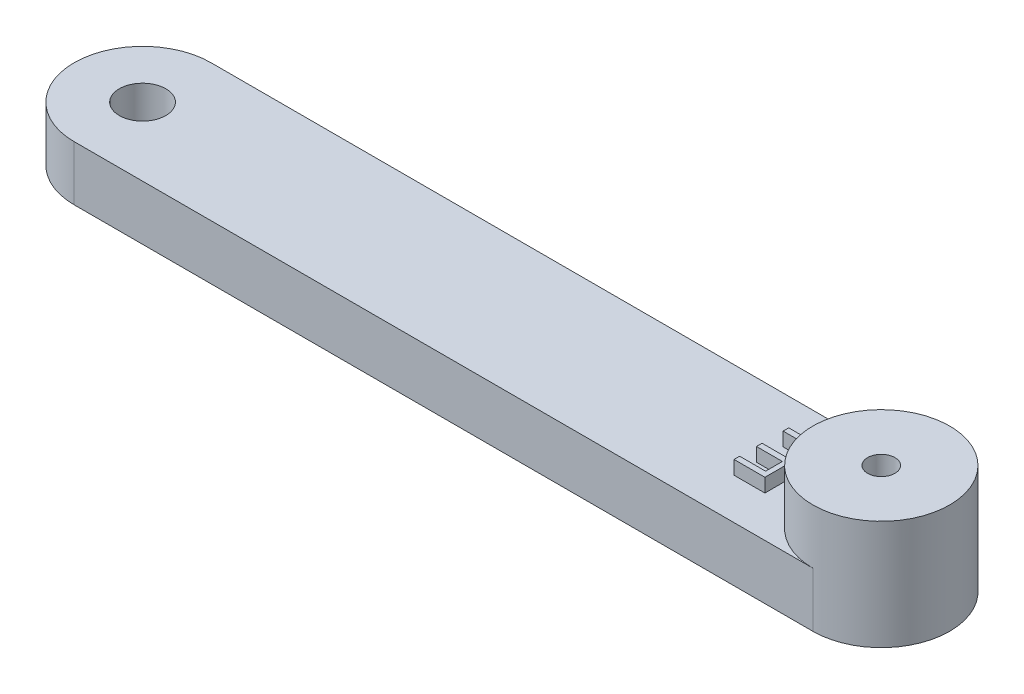
ISO-10303-21;
HEADER;
FILE_DESCRIPTION(('STEP AP214'),'2;1');
FILE_NAME('part.step','',(''),(''),'','','');
FILE_SCHEMA(('AUTOMOTIVE_DESIGN { 1 0 10303 214 1 1 1 1 }'));
ENDSEC;
DATA;
#1=APPLICATION_CONTEXT('core data for automotive mechanical design processes');
#2=APPLICATION_PROTOCOL_DEFINITION('international standard','automotive_design',2000,#1);
#3=PRODUCT_CONTEXT('',#1,'mechanical');
#4=PRODUCT('Part','Part','',(#3));
#5=PRODUCT_RELATED_PRODUCT_CATEGORY('part','',(#4));
#6=PRODUCT_DEFINITION_FORMATION('','',#4);
#7=PRODUCT_DEFINITION_CONTEXT('part definition',#1,'design');
#8=PRODUCT_DEFINITION('design','',#6,#7);
#9=PRODUCT_DEFINITION_SHAPE('','',#8);
#10=(LENGTH_UNIT() NAMED_UNIT(*) SI_UNIT(.MILLI.,.METRE.));
#11=(NAMED_UNIT(*) PLANE_ANGLE_UNIT() SI_UNIT($,.RADIAN.));
#12=(NAMED_UNIT(*) SI_UNIT($,.STERADIAN.) SOLID_ANGLE_UNIT());
#13=UNCERTAINTY_MEASURE_WITH_UNIT(LENGTH_MEASURE(1.E-05),#10,'distance_accuracy_value','');
#14=(GEOMETRIC_REPRESENTATION_CONTEXT(3) GLOBAL_UNCERTAINTY_ASSIGNED_CONTEXT((#13)) GLOBAL_UNIT_ASSIGNED_CONTEXT((#10,
#11,#12)) REPRESENTATION_CONTEXT('',''));
#15=CARTESIAN_POINT('',(0.,0.,0.));
#16=DIRECTION('',(0.,0.,1.));
#17=DIRECTION('',(1.,0.,0.));
#18=AXIS2_PLACEMENT_3D('',#15,#16,#17);
#19=CARTESIAN_POINT('',(-13.5,2.,0.));
#20=DIRECTION('',(0.,-1.,0.));
#21=DIRECTION('',(0.,0.,-1.));
#22=AXIS2_PLACEMENT_3D('',#19,#20,#21);
#23=CYLINDRICAL_SURFACE('',#22,2.5);
#24=CARTESIAN_POINT('',(-13.5,0.,0.));
#25=DIRECTION('',(0.,1.,0.));
#26=DIRECTION('',(0.,0.,1.));
#27=AXIS2_PLACEMENT_3D('',#24,#25,#26);
#28=CIRCLE('',#27,2.5);
#29=CARTESIAN_POINT('',(-13.5,0.,-2.5));
#30=VERTEX_POINT('',#29);
#31=CARTESIAN_POINT('',(-13.5,0.,2.5));
#32=VERTEX_POINT('',#31);
#33=EDGE_CURVE('E260',#30,#32,#28,.T.);
#34=ORIENTED_EDGE('',*,*,#33,.T.);
#35=DIRECTION('',(0.,-1.,0.));
#36=VECTOR('',#35,1.);
#37=CARTESIAN_POINT('',(-13.5,2.,2.5));
#38=LINE('',#37,#36);
#39=CARTESIAN_POINT('',(-13.5,2.,2.5));
#40=VERTEX_POINT('',#39);
#41=EDGE_CURVE('E35',#40,#32,#38,.T.);
#42=ORIENTED_EDGE('',*,*,#41,.F.);
#43=CARTESIAN_POINT('',(-13.5,2.,0.));
#44=DIRECTION('',(0.,1.,0.));
#45=DIRECTION('',(0.,0.,1.));
#46=AXIS2_PLACEMENT_3D('',#43,#44,#45);
#47=CIRCLE('',#46,2.5);
#48=CARTESIAN_POINT('',(-13.5,2.,-2.5));
#49=VERTEX_POINT('',#48);
#50=EDGE_CURVE('E263',#49,#40,#47,.T.);
#51=ORIENTED_EDGE('',*,*,#50,.F.);
#52=DIRECTION('',(0.,-1.,0.));
#53=VECTOR('',#52,1.);
#54=CARTESIAN_POINT('',(-13.5,2.,-2.5));
#55=LINE('',#54,#53);
#56=EDGE_CURVE('E272',#49,#30,#55,.T.);
#57=ORIENTED_EDGE('',*,*,#56,.T.);
#58=EDGE_LOOP('',(#34,#42,#51,#57));
#59=FACE_BOUND('',#58,.T.);
#60=ADVANCED_FACE('F32',(#59),#23,.T.);
#61=CARTESIAN_POINT('',(-13.5,2.,2.5));
#62=DIRECTION('',(0.,0.,-1.));
#63=DIRECTION('',(-1.,0.,0.));
#64=AXIS2_PLACEMENT_3D('',#61,#62,#63);
#65=PLANE('',#64);
#66=DIRECTION('',(1.,0.,0.));
#67=VECTOR('',#66,1.);
#68=CARTESIAN_POINT('',(-13.5,0.,2.5));
#69=LINE('',#68,#67);
#70=CARTESIAN_POINT('',(13.5,0.,2.5));
#71=VERTEX_POINT('',#70);
#72=EDGE_CURVE('E275',#32,#71,#69,.T.);
#73=ORIENTED_EDGE('',*,*,#72,.T.);
#74=DIRECTION('',(0.,-1.,0.));
#75=VECTOR('',#74,1.);
#76=CARTESIAN_POINT('',(13.5,2.,2.5));
#77=LINE('',#76,#75);
#78=CARTESIAN_POINT('',(13.5,2.,2.5));
#79=VERTEX_POINT('',#78);
#80=EDGE_CURVE('E284',#79,#71,#77,.T.);
#81=ORIENTED_EDGE('',*,*,#80,.F.);
#82=DIRECTION('',(1.,0.,0.));
#83=VECTOR('',#82,1.);
#84=CARTESIAN_POINT('',(-13.5,2.,2.5));
#85=LINE('',#84,#83);
#86=EDGE_CURVE('E266',#40,#79,#85,.T.);
#87=ORIENTED_EDGE('',*,*,#86,.F.);
#88=ORIENTED_EDGE('',*,*,#41,.T.);
#89=EDGE_LOOP('',(#73,#81,#87,#88));
#90=FACE_BOUND('',#89,.T.);
#91=ADVANCED_FACE('F291',(#90),#65,.F.);
#92=CARTESIAN_POINT('',(13.5,2.,0.));
#93=DIRECTION('',(0.,-1.,0.));
#94=DIRECTION('',(0.,0.,-1.));
#95=AXIS2_PLACEMENT_3D('',#92,#93,#94);
#96=CYLINDRICAL_SURFACE('',#95,2.5);
#97=CARTESIAN_POINT('',(13.5,0.,0.));
#98=DIRECTION('',(0.,1.,0.));
#99=DIRECTION('',(0.,0.,1.));
#100=AXIS2_PLACEMENT_3D('',#97,#98,#99);
#101=CIRCLE('',#100,2.5);
#102=CARTESIAN_POINT('',(13.5,0.,-2.5));
#103=VERTEX_POINT('',#102);
#104=EDGE_CURVE('E277',#71,#103,#101,.T.);
#105=ORIENTED_EDGE('',*,*,#104,.T.);
#106=DIRECTION('',(0.,-1.,0.));
#107=VECTOR('',#106,1.);
#108=CARTESIAN_POINT('',(13.5,2.,-2.5));
#109=LINE('',#108,#107);
#110=CARTESIAN_POINT('',(13.5,2.,-2.5));
#111=VERTEX_POINT('',#110);
#112=EDGE_CURVE('E282',#111,#103,#109,.T.);
#113=ORIENTED_EDGE('',*,*,#112,.F.);
#114=CARTESIAN_POINT('',(13.5,2.,0.));
#115=DIRECTION('',(0.,1.,0.));
#116=DIRECTION('',(0.,0.,1.));
#117=AXIS2_PLACEMENT_3D('',#114,#115,#116);
#118=CIRCLE('',#117,2.5);
#119=EDGE_CURVE('E11',#111,#79,#118,.T.);
#120=ORIENTED_EDGE('',*,*,#119,.T.);
#121=ORIENTED_EDGE('',*,*,#80,.T.);
#122=EDGE_LOOP('',(#105,#113,#120,#121));
#123=FACE_BOUND('',#122,.T.);
#124=CARTESIAN_POINT('',(13.5,4.,0.));
#125=DIRECTION('',(0.,1.,0.));
#126=DIRECTION('',(0.,0.,1.));
#127=AXIS2_PLACEMENT_3D('',#124,#125,#126);
#128=CIRCLE('',#127,2.5);
#129=CARTESIAN_POINT('',(13.5,4.,2.5));
#130=VERTEX_POINT('',#129);
#131=EDGE_CURVE('E253',#130,#130,#128,.T.);
#132=ORIENTED_EDGE('',*,*,#131,.F.);
#133=EDGE_LOOP('',(#132));
#134=FACE_BOUND('',#133,.T.);
#135=ADVANCED_FACE('F300',(#123,#134),#96,.T.);
#136=CARTESIAN_POINT('',(-13.5,2.,-2.5));
#137=DIRECTION('',(0.,0.,1.));
#138=DIRECTION('',(1.,0.,0.));
#139=AXIS2_PLACEMENT_3D('',#136,#137,#138);
#140=PLANE('',#139);
#141=DIRECTION('',(-1.,0.,0.));
#142=VECTOR('',#141,1.);
#143=CARTESIAN_POINT('',(-13.5,0.,-2.5));
#144=LINE('',#143,#142);
#145=EDGE_CURVE('E267',#103,#30,#144,.T.);
#146=ORIENTED_EDGE('',*,*,#145,.T.);
#147=ORIENTED_EDGE('',*,*,#56,.F.);
#148=DIRECTION('',(-1.,0.,0.));
#149=VECTOR('',#148,1.);
#150=CARTESIAN_POINT('',(-13.5,2.,-2.5));
#151=LINE('',#150,#149);
#152=EDGE_CURVE('E270',#111,#49,#151,.T.);
#153=ORIENTED_EDGE('',*,*,#152,.F.);
#154=ORIENTED_EDGE('',*,*,#112,.T.);
#155=EDGE_LOOP('',(#146,#147,#153,#154));
#156=FACE_BOUND('',#155,.T.);
#157=ADVANCED_FACE('F304',(#156),#140,.F.);
#158=CARTESIAN_POINT('',(-13.5,2.,0.));
#159=DIRECTION('',(0.,1.,0.));
#160=DIRECTION('',(0.,0.,1.));
#161=AXIS2_PLACEMENT_3D('',#158,#159,#160);
#162=PLANE('',#161);
#163=DIRECTION('',(0.,0.,1.));
#164=VECTOR('',#163,1.);
#165=CARTESIAN_POINT('',(10.2461419435855,2.,-1.));
#166=LINE('',#165,#164);
#167=CARTESIAN_POINT('',(10.2461419435855,2.,-1.));
#168=VERTEX_POINT('',#167);
#169=CARTESIAN_POINT('',(10.2461419435855,2.,1.));
#170=VERTEX_POINT('',#169);
#171=EDGE_CURVE('E199',#168,#170,#166,.T.);
#172=ORIENTED_EDGE('',*,*,#171,.T.);
#173=DIRECTION('',(-1.,0.,0.));
#174=VECTOR('',#173,1.);
#175=CARTESIAN_POINT('',(10.2461419435855,2.,1.));
#176=LINE('',#175,#174);
#177=CARTESIAN_POINT('',(9.11793681538034,2.,1.));
#178=VERTEX_POINT('',#177);
#179=EDGE_CURVE('E150',#170,#178,#176,.T.);
#180=ORIENTED_EDGE('',*,*,#179,.T.);
#181=DIRECTION('',(0.,0.,-1.));
#182=VECTOR('',#181,1.);
#183=CARTESIAN_POINT('',(9.11793681538034,2.,1.));
#184=LINE('',#183,#182);
#185=CARTESIAN_POINT('',(9.11793681538034,2.,0.794871794871795));
#186=VERTEX_POINT('',#185);
#187=EDGE_CURVE('E202',#178,#186,#184,.T.);
#188=ORIENTED_EDGE('',*,*,#187,.T.);
#189=DIRECTION('',(1.,0.,0.));
#190=VECTOR('',#189,1.);
#191=CARTESIAN_POINT('',(9.11793681538034,2.,0.794871794871795));
#192=LINE('',#191,#190);
#193=CARTESIAN_POINT('',(10.0666547640983,2.,0.794871794871795));
#194=VERTEX_POINT('',#193);
#195=EDGE_CURVE('E204',#186,#194,#192,.T.);
#196=ORIENTED_EDGE('',*,*,#195,.T.);
#197=DIRECTION('',(0.,0.,-1.));
#198=VECTOR('',#197,1.);
#199=CARTESIAN_POINT('',(10.0666547640983,2.,0.794871794871795));
#200=LINE('',#199,#198);
#201=CARTESIAN_POINT('',(10.0666547640983,2.,0.179487179487179));
#202=VERTEX_POINT('',#201);
#203=EDGE_CURVE('E206',#194,#202,#200,.T.);
#204=ORIENTED_EDGE('',*,*,#203,.T.);
#205=DIRECTION('',(-1.,0.,0.));
#206=VECTOR('',#205,1.);
#207=CARTESIAN_POINT('',(10.0666547640983,2.,0.179487179487179));
#208=LINE('',#207,#206);
#209=CARTESIAN_POINT('',(9.11793681538034,2.,0.179487179487179));
#210=VERTEX_POINT('',#209);
#211=EDGE_CURVE('E208',#202,#210,#208,.T.);
#212=ORIENTED_EDGE('',*,*,#211,.T.);
#213=DIRECTION('',(0.,0.,-1.));
#214=VECTOR('',#213,1.);
#215=CARTESIAN_POINT('',(9.11793681538034,2.,0.179487179487179));
#216=LINE('',#215,#214);
#217=CARTESIAN_POINT('',(9.11793681538034,2.,-0.0256410256410261));
#218=VERTEX_POINT('',#217);
#219=EDGE_CURVE('E210',#210,#218,#216,.T.);
#220=ORIENTED_EDGE('',*,*,#219,.T.);
#221=DIRECTION('',(1.,0.,0.));
#222=VECTOR('',#221,1.);
#223=CARTESIAN_POINT('',(9.11793681538034,2.,-0.0256410256410261));
#224=LINE('',#223,#222);
#225=CARTESIAN_POINT('',(10.0666547640983,2.,-0.0256410256410261));
#226=VERTEX_POINT('',#225);
#227=EDGE_CURVE('E212',#218,#226,#224,.T.);
#228=ORIENTED_EDGE('',*,*,#227,.T.);
#229=DIRECTION('',(0.,0.,-1.));
#230=VECTOR('',#229,1.);
#231=CARTESIAN_POINT('',(10.0666547640983,2.,-0.0256410256410261));
#232=LINE('',#231,#230);
#233=CARTESIAN_POINT('',(10.0666547640983,2.,-0.794871794871795));
#234=VERTEX_POINT('',#233);
#235=EDGE_CURVE('E214',#226,#234,#232,.T.);
#236=ORIENTED_EDGE('',*,*,#235,.T.);
#237=DIRECTION('',(-1.,0.,0.));
#238=VECTOR('',#237,1.);
#239=CARTESIAN_POINT('',(10.0666547640983,2.,-0.794871794871795));
#240=LINE('',#239,#238);
#241=CARTESIAN_POINT('',(9.11793681538034,2.,-0.794871794871795));
#242=VERTEX_POINT('',#241);
#243=EDGE_CURVE('E216',#234,#242,#240,.T.);
#244=ORIENTED_EDGE('',*,*,#243,.T.);
#245=DIRECTION('',(0.,0.,-1.));
#246=VECTOR('',#245,1.);
#247=CARTESIAN_POINT('',(9.11793681538034,2.,-0.794871794871795));
#248=LINE('',#247,#246);
#249=CARTESIAN_POINT('',(9.11793681538034,2.,-1.));
#250=VERTEX_POINT('',#249);
#251=EDGE_CURVE('E52',#242,#250,#248,.T.);
#252=ORIENTED_EDGE('',*,*,#251,.T.);
#253=DIRECTION('',(1.,0.,0.));
#254=VECTOR('',#253,1.);
#255=CARTESIAN_POINT('',(9.11793681538034,2.,-1.));
#256=LINE('',#255,#254);
#257=EDGE_CURVE('E47',#250,#168,#256,.T.);
#258=ORIENTED_EDGE('',*,*,#257,.T.);
#259=EDGE_LOOP('',(#172,#180,#188,#196,#204,#212,#220,#228,#236,#244,#252,#258));
#260=FACE_BOUND('',#259,.T.);
#261=ORIENTED_EDGE('',*,*,#119,.F.);
#262=ORIENTED_EDGE('',*,*,#152,.T.);
#263=ORIENTED_EDGE('',*,*,#50,.T.);
#264=ORIENTED_EDGE('',*,*,#86,.T.);
#265=EDGE_LOOP('',(#261,#262,#263,#264));
#266=FACE_BOUND('',#265,.T.);
#267=CARTESIAN_POINT('',(-13.5,2.,0.));
#268=DIRECTION('',(0.,1.,0.));
#269=DIRECTION('',(0.,0.,1.));
#270=AXIS2_PLACEMENT_3D('',#267,#268,#269);
#271=CIRCLE('',#270,0.85);
#272=CARTESIAN_POINT('',(-13.5,2.,0.85));
#273=VERTEX_POINT('',#272);
#274=EDGE_CURVE('E255',#273,#273,#271,.T.);
#275=ORIENTED_EDGE('',*,*,#274,.F.);
#276=EDGE_LOOP('',(#275));
#277=FACE_BOUND('',#276,.T.);
#278=ADVANCED_FACE('F306',(#260,#266,#277),#162,.T.);
#279=CARTESIAN_POINT('',(-13.5,0.,0.));
#280=DIRECTION('',(0.,1.,0.));
#281=DIRECTION('',(0.,0.,1.));
#282=AXIS2_PLACEMENT_3D('',#279,#280,#281);
#283=PLANE('',#282);
#284=CARTESIAN_POINT('',(13.5,0.,0.));
#285=DIRECTION('',(0.,1.,0.));
#286=DIRECTION('',(0.,0.,1.));
#287=AXIS2_PLACEMENT_3D('',#284,#285,#286);
#288=CIRCLE('',#287,0.500000000000001);
#289=CARTESIAN_POINT('',(13.5,0.,0.500000000000001));
#290=VERTEX_POINT('',#289);
#291=EDGE_CURVE('E250',#290,#290,#288,.F.);
#292=ORIENTED_EDGE('',*,*,#291,.F.);
#293=EDGE_LOOP('',(#292));
#294=FACE_BOUND('',#293,.T.);
#295=CARTESIAN_POINT('',(-13.5,0.,0.));
#296=DIRECTION('',(0.,1.,0.));
#297=DIRECTION('',(0.,0.,1.));
#298=AXIS2_PLACEMENT_3D('',#295,#296,#297);
#299=CIRCLE('',#298,0.85);
#300=CARTESIAN_POINT('',(-13.5,0.,0.85));
#301=VERTEX_POINT('',#300);
#302=EDGE_CURVE('E257',#301,#301,#299,.T.);
#303=ORIENTED_EDGE('',*,*,#302,.T.);
#304=EDGE_LOOP('',(#303));
#305=FACE_BOUND('',#304,.T.);
#306=ORIENTED_EDGE('',*,*,#33,.F.);
#307=ORIENTED_EDGE('',*,*,#145,.F.);
#308=ORIENTED_EDGE('',*,*,#104,.F.);
#309=ORIENTED_EDGE('',*,*,#72,.F.);
#310=EDGE_LOOP('',(#306,#307,#308,#309));
#311=FACE_BOUND('',#310,.T.);
#312=ADVANCED_FACE('F298',(#294,#305,#311),#283,.F.);
#313=CARTESIAN_POINT('',(-13.5,0.,0.));
#314=DIRECTION('',(0.,1.,0.));
#315=DIRECTION('',(0.,0.,1.));
#316=AXIS2_PLACEMENT_3D('',#313,#314,#315);
#317=CYLINDRICAL_SURFACE('',#316,0.85);
#318=ORIENTED_EDGE('',*,*,#302,.F.);
#319=EDGE_LOOP('',(#318));
#320=FACE_BOUND('',#319,.T.);
#321=ORIENTED_EDGE('',*,*,#274,.T.);
#322=EDGE_LOOP('',(#321));
#323=FACE_BOUND('',#322,.T.);
#324=ADVANCED_FACE('F312',(#320,#323),#317,.F.);
#325=CARTESIAN_POINT('',(13.5,4.,0.));
#326=DIRECTION('',(0.,1.,0.));
#327=DIRECTION('',(0.,0.,1.));
#328=AXIS2_PLACEMENT_3D('',#325,#326,#327);
#329=PLANE('',#328);
#330=CARTESIAN_POINT('',(13.5,4.,0.));
#331=DIRECTION('',(0.,1.,0.));
#332=DIRECTION('',(0.,0.,1.));
#333=AXIS2_PLACEMENT_3D('',#330,#331,#332);
#334=CIRCLE('',#333,0.500000000000001);
#335=CARTESIAN_POINT('',(13.5,4.,0.500000000000001));
#336=VERTEX_POINT('',#335);
#337=EDGE_CURVE('E220',#336,#336,#334,.T.);
#338=ORIENTED_EDGE('',*,*,#337,.F.);
#339=EDGE_LOOP('',(#338));
#340=FACE_BOUND('',#339,.T.);
#341=ORIENTED_EDGE('',*,*,#131,.T.);
#342=EDGE_LOOP('',(#341));
#343=FACE_BOUND('',#342,.T.);
#344=ADVANCED_FACE('F314',(#340,#343),#329,.T.);
#345=CARTESIAN_POINT('',(13.5,-0.00100000000000013,0.));
#346=DIRECTION('',(0.,1.,0.));
#347=DIRECTION('',(0.,0.,1.));
#348=AXIS2_PLACEMENT_3D('',#345,#346,#347);
#349=CYLINDRICAL_SURFACE('',#348,0.500000000000001);
#350=ORIENTED_EDGE('',*,*,#337,.T.);
#351=EDGE_LOOP('',(#350));
#352=FACE_BOUND('',#351,.T.);
#353=ORIENTED_EDGE('',*,*,#291,.T.);
#354=EDGE_LOOP('',(#353));
#355=FACE_BOUND('',#354,.T.);
#356=ADVANCED_FACE('F321',(#352,#355),#349,.F.);
#357=CARTESIAN_POINT('',(10.2461419435855,2.5,-1.));
#358=DIRECTION('',(1.,0.,0.));
#359=DIRECTION('',(0.,0.,-1.));
#360=AXIS2_PLACEMENT_3D('',#357,#358,#359);
#361=PLANE('',#360);
#362=ORIENTED_EDGE('',*,*,#171,.F.);
#363=DIRECTION('',(0.,-1.,0.));
#364=VECTOR('',#363,1.);
#365=CARTESIAN_POINT('',(10.2461419435855,2.5,-1.));
#366=LINE('',#365,#364);
#367=CARTESIAN_POINT('',(10.2461419435855,2.5,-1.));
#368=VERTEX_POINT('',#367);
#369=EDGE_CURVE('E169',#368,#168,#366,.T.);
#370=ORIENTED_EDGE('',*,*,#369,.F.);
#371=DIRECTION('',(0.,0.,1.));
#372=VECTOR('',#371,1.);
#373=CARTESIAN_POINT('',(10.2461419435855,2.5,-1.));
#374=LINE('',#373,#372);
#375=CARTESIAN_POINT('',(10.2461419435855,2.5,1.));
#376=VERTEX_POINT('',#375);
#377=EDGE_CURVE('E162',#368,#376,#374,.T.);
#378=ORIENTED_EDGE('',*,*,#377,.T.);
#379=DIRECTION('',(0.,-1.,0.));
#380=VECTOR('',#379,1.);
#381=CARTESIAN_POINT('',(10.2461419435855,2.5,1.));
#382=LINE('',#381,#380);
#383=EDGE_CURVE('E145',#376,#170,#382,.T.);
#384=ORIENTED_EDGE('',*,*,#383,.T.);
#385=EDGE_LOOP('',(#362,#370,#378,#384));
#386=FACE_BOUND('',#385,.T.);
#387=ADVANCED_FACE('F168',(#386),#361,.T.);
#388=CARTESIAN_POINT('',(9.11793681538034,2.5,-1.));
#389=DIRECTION('',(0.,0.,-1.));
#390=DIRECTION('',(-1.,0.,0.));
#391=AXIS2_PLACEMENT_3D('',#388,#389,#390);
#392=PLANE('',#391);
#393=ORIENTED_EDGE('',*,*,#257,.F.);
#394=DIRECTION('',(0.,-1.,0.));
#395=VECTOR('',#394,1.);
#396=CARTESIAN_POINT('',(9.11793681538034,2.5,-1.));
#397=LINE('',#396,#395);
#398=CARTESIAN_POINT('',(9.11793681538034,2.5,-1.));
#399=VERTEX_POINT('',#398);
#400=EDGE_CURVE('E221',#399,#250,#397,.T.);
#401=ORIENTED_EDGE('',*,*,#400,.F.);
#402=DIRECTION('',(1.,0.,0.));
#403=VECTOR('',#402,1.);
#404=CARTESIAN_POINT('',(9.11793681538034,2.5,-1.));
#405=LINE('',#404,#403);
#406=EDGE_CURVE('E155',#399,#368,#405,.T.);
#407=ORIENTED_EDGE('',*,*,#406,.T.);
#408=ORIENTED_EDGE('',*,*,#369,.T.);
#409=EDGE_LOOP('',(#393,#401,#407,#408));
#410=FACE_BOUND('',#409,.T.);
#411=ADVANCED_FACE('F375',(#410),#392,.T.);
#412=CARTESIAN_POINT('',(9.11793681538034,2.5,-0.794871794871795));
#413=DIRECTION('',(-1.,0.,0.));
#414=DIRECTION('',(0.,0.,1.));
#415=AXIS2_PLACEMENT_3D('',#412,#413,#414);
#416=PLANE('',#415);
#417=ORIENTED_EDGE('',*,*,#251,.F.);
#418=DIRECTION('',(0.,-1.,0.));
#419=VECTOR('',#418,1.);
#420=CARTESIAN_POINT('',(9.11793681538034,2.5,-0.794871794871795));
#421=LINE('',#420,#419);
#422=CARTESIAN_POINT('',(9.11793681538034,2.5,-0.794871794871795));
#423=VERTEX_POINT('',#422);
#424=EDGE_CURVE('E223',#423,#242,#421,.T.);
#425=ORIENTED_EDGE('',*,*,#424,.F.);
#426=DIRECTION('',(0.,0.,-1.));
#427=VECTOR('',#426,1.);
#428=CARTESIAN_POINT('',(9.11793681538034,2.5,-0.794871794871795));
#429=LINE('',#428,#427);
#430=EDGE_CURVE('E195',#423,#399,#429,.T.);
#431=ORIENTED_EDGE('',*,*,#430,.T.);
#432=ORIENTED_EDGE('',*,*,#400,.T.);
#433=EDGE_LOOP('',(#417,#425,#431,#432));
#434=FACE_BOUND('',#433,.T.);
#435=ADVANCED_FACE('F381',(#434),#416,.T.);
#436=CARTESIAN_POINT('',(10.0666547640983,2.5,-0.794871794871795));
#437=DIRECTION('',(0.,0.,1.));
#438=DIRECTION('',(1.,0.,0.));
#439=AXIS2_PLACEMENT_3D('',#436,#437,#438);
#440=PLANE('',#439);
#441=ORIENTED_EDGE('',*,*,#243,.F.);
#442=DIRECTION('',(0.,-1.,0.));
#443=VECTOR('',#442,1.);
#444=CARTESIAN_POINT('',(10.0666547640983,2.5,-0.794871794871795));
#445=LINE('',#444,#443);
#446=CARTESIAN_POINT('',(10.0666547640983,2.5,-0.794871794871795));
#447=VERTEX_POINT('',#446);
#448=EDGE_CURVE('E226',#447,#234,#445,.T.);
#449=ORIENTED_EDGE('',*,*,#448,.F.);
#450=DIRECTION('',(-1.,0.,0.));
#451=VECTOR('',#450,1.);
#452=CARTESIAN_POINT('',(10.0666547640983,2.5,-0.794871794871795));
#453=LINE('',#452,#451);
#454=EDGE_CURVE('E192',#447,#423,#453,.T.);
#455=ORIENTED_EDGE('',*,*,#454,.T.);
#456=ORIENTED_EDGE('',*,*,#424,.T.);
#457=EDGE_LOOP('',(#441,#449,#455,#456));
#458=FACE_BOUND('',#457,.T.);
#459=ADVANCED_FACE('F389',(#458),#440,.T.);
#460=CARTESIAN_POINT('',(10.0666547640983,2.5,-0.0256410256410261));
#461=DIRECTION('',(-1.,0.,0.));
#462=DIRECTION('',(0.,0.,1.));
#463=AXIS2_PLACEMENT_3D('',#460,#461,#462);
#464=PLANE('',#463);
#465=ORIENTED_EDGE('',*,*,#235,.F.);
#466=DIRECTION('',(0.,-1.,0.));
#467=VECTOR('',#466,1.);
#468=CARTESIAN_POINT('',(10.0666547640983,2.5,-0.0256410256410261));
#469=LINE('',#468,#467);
#470=CARTESIAN_POINT('',(10.0666547640983,2.5,-0.0256410256410261));
#471=VERTEX_POINT('',#470);
#472=EDGE_CURVE('E229',#471,#226,#469,.T.);
#473=ORIENTED_EDGE('',*,*,#472,.F.);
#474=DIRECTION('',(0.,0.,-1.));
#475=VECTOR('',#474,1.);
#476=CARTESIAN_POINT('',(10.0666547640983,2.5,-0.0256410256410261));
#477=LINE('',#476,#475);
#478=EDGE_CURVE('E189',#471,#447,#477,.T.);
#479=ORIENTED_EDGE('',*,*,#478,.T.);
#480=ORIENTED_EDGE('',*,*,#448,.T.);
#481=EDGE_LOOP('',(#465,#473,#479,#480));
#482=FACE_BOUND('',#481,.T.);
#483=ADVANCED_FACE('F397',(#482),#464,.T.);
#484=CARTESIAN_POINT('',(9.11793681538034,2.5,-0.0256410256410261));
#485=DIRECTION('',(0.,0.,-1.));
#486=DIRECTION('',(-1.,0.,0.));
#487=AXIS2_PLACEMENT_3D('',#484,#485,#486);
#488=PLANE('',#487);
#489=ORIENTED_EDGE('',*,*,#227,.F.);
#490=DIRECTION('',(0.,-1.,0.));
#491=VECTOR('',#490,1.);
#492=CARTESIAN_POINT('',(9.11793681538034,2.5,-0.0256410256410261));
#493=LINE('',#492,#491);
#494=CARTESIAN_POINT('',(9.11793681538034,2.5,-0.0256410256410261));
#495=VERTEX_POINT('',#494);
#496=EDGE_CURVE('E232',#495,#218,#493,.T.);
#497=ORIENTED_EDGE('',*,*,#496,.F.);
#498=DIRECTION('',(1.,0.,0.));
#499=VECTOR('',#498,1.);
#500=CARTESIAN_POINT('',(9.11793681538034,2.5,-0.0256410256410261));
#501=LINE('',#500,#499);
#502=EDGE_CURVE('E186',#495,#471,#501,.T.);
#503=ORIENTED_EDGE('',*,*,#502,.T.);
#504=ORIENTED_EDGE('',*,*,#472,.T.);
#505=EDGE_LOOP('',(#489,#497,#503,#504));
#506=FACE_BOUND('',#505,.T.);
#507=ADVANCED_FACE('F405',(#506),#488,.T.);
#508=CARTESIAN_POINT('',(9.11793681538034,2.5,0.179487179487179));
#509=DIRECTION('',(-1.,0.,0.));
#510=DIRECTION('',(0.,0.,1.));
#511=AXIS2_PLACEMENT_3D('',#508,#509,#510);
#512=PLANE('',#511);
#513=ORIENTED_EDGE('',*,*,#219,.F.);
#514=DIRECTION('',(0.,-1.,0.));
#515=VECTOR('',#514,1.);
#516=CARTESIAN_POINT('',(9.11793681538034,2.5,0.179487179487179));
#517=LINE('',#516,#515);
#518=CARTESIAN_POINT('',(9.11793681538034,2.5,0.179487179487179));
#519=VERTEX_POINT('',#518);
#520=EDGE_CURVE('E235',#519,#210,#517,.T.);
#521=ORIENTED_EDGE('',*,*,#520,.F.);
#522=DIRECTION('',(0.,0.,-1.));
#523=VECTOR('',#522,1.);
#524=CARTESIAN_POINT('',(9.11793681538034,2.5,0.179487179487179));
#525=LINE('',#524,#523);
#526=EDGE_CURVE('E183',#519,#495,#525,.T.);
#527=ORIENTED_EDGE('',*,*,#526,.T.);
#528=ORIENTED_EDGE('',*,*,#496,.T.);
#529=EDGE_LOOP('',(#513,#521,#527,#528));
#530=FACE_BOUND('',#529,.T.);
#531=ADVANCED_FACE('F413',(#530),#512,.T.);
#532=CARTESIAN_POINT('',(10.0666547640983,2.5,0.179487179487179));
#533=DIRECTION('',(0.,0.,1.));
#534=DIRECTION('',(1.,0.,0.));
#535=AXIS2_PLACEMENT_3D('',#532,#533,#534);
#536=PLANE('',#535);
#537=ORIENTED_EDGE('',*,*,#211,.F.);
#538=DIRECTION('',(0.,-1.,0.));
#539=VECTOR('',#538,1.);
#540=CARTESIAN_POINT('',(10.0666547640983,2.5,0.179487179487179));
#541=LINE('',#540,#539);
#542=CARTESIAN_POINT('',(10.0666547640983,2.5,0.179487179487179));
#543=VERTEX_POINT('',#542);
#544=EDGE_CURVE('E238',#543,#202,#541,.T.);
#545=ORIENTED_EDGE('',*,*,#544,.F.);
#546=DIRECTION('',(-1.,0.,0.));
#547=VECTOR('',#546,1.);
#548=CARTESIAN_POINT('',(10.0666547640983,2.5,0.179487179487179));
#549=LINE('',#548,#547);
#550=EDGE_CURVE('E180',#543,#519,#549,.T.);
#551=ORIENTED_EDGE('',*,*,#550,.T.);
#552=ORIENTED_EDGE('',*,*,#520,.T.);
#553=EDGE_LOOP('',(#537,#545,#551,#552));
#554=FACE_BOUND('',#553,.T.);
#555=ADVANCED_FACE('F421',(#554),#536,.T.);
#556=CARTESIAN_POINT('',(10.0666547640983,2.5,0.794871794871795));
#557=DIRECTION('',(-1.,0.,0.));
#558=DIRECTION('',(0.,0.,1.));
#559=AXIS2_PLACEMENT_3D('',#556,#557,#558);
#560=PLANE('',#559);
#561=ORIENTED_EDGE('',*,*,#203,.F.);
#562=DIRECTION('',(0.,-1.,0.));
#563=VECTOR('',#562,1.);
#564=CARTESIAN_POINT('',(10.0666547640983,2.5,0.794871794871795));
#565=LINE('',#564,#563);
#566=CARTESIAN_POINT('',(10.0666547640983,2.5,0.794871794871795));
#567=VERTEX_POINT('',#566);
#568=EDGE_CURVE('E241',#567,#194,#565,.T.);
#569=ORIENTED_EDGE('',*,*,#568,.F.);
#570=DIRECTION('',(0.,0.,-1.));
#571=VECTOR('',#570,1.);
#572=CARTESIAN_POINT('',(10.0666547640983,2.5,0.794871794871795));
#573=LINE('',#572,#571);
#574=EDGE_CURVE('E177',#567,#543,#573,.T.);
#575=ORIENTED_EDGE('',*,*,#574,.T.);
#576=ORIENTED_EDGE('',*,*,#544,.T.);
#577=EDGE_LOOP('',(#561,#569,#575,#576));
#578=FACE_BOUND('',#577,.T.);
#579=ADVANCED_FACE('F429',(#578),#560,.T.);
#580=CARTESIAN_POINT('',(9.11793681538034,2.5,0.794871794871795));
#581=DIRECTION('',(0.,0.,-1.));
#582=DIRECTION('',(-1.,0.,0.));
#583=AXIS2_PLACEMENT_3D('',#580,#581,#582);
#584=PLANE('',#583);
#585=ORIENTED_EDGE('',*,*,#195,.F.);
#586=DIRECTION('',(0.,-1.,0.));
#587=VECTOR('',#586,1.);
#588=CARTESIAN_POINT('',(9.11793681538034,2.5,0.794871794871795));
#589=LINE('',#588,#587);
#590=CARTESIAN_POINT('',(9.11793681538034,2.5,0.794871794871795));
#591=VERTEX_POINT('',#590);
#592=EDGE_CURVE('E244',#591,#186,#589,.T.);
#593=ORIENTED_EDGE('',*,*,#592,.F.);
#594=DIRECTION('',(1.,0.,0.));
#595=VECTOR('',#594,1.);
#596=CARTESIAN_POINT('',(9.11793681538034,2.5,0.794871794871795));
#597=LINE('',#596,#595);
#598=EDGE_CURVE('E174',#591,#567,#597,.T.);
#599=ORIENTED_EDGE('',*,*,#598,.T.);
#600=ORIENTED_EDGE('',*,*,#568,.T.);
#601=EDGE_LOOP('',(#585,#593,#599,#600));
#602=FACE_BOUND('',#601,.T.);
#603=ADVANCED_FACE('F437',(#602),#584,.T.);
#604=CARTESIAN_POINT('',(9.11793681538034,2.5,1.));
#605=DIRECTION('',(-1.,0.,0.));
#606=DIRECTION('',(0.,0.,1.));
#607=AXIS2_PLACEMENT_3D('',#604,#605,#606);
#608=PLANE('',#607);
#609=ORIENTED_EDGE('',*,*,#187,.F.);
#610=DIRECTION('',(0.,-1.,0.));
#611=VECTOR('',#610,1.);
#612=CARTESIAN_POINT('',(9.11793681538034,2.5,1.));
#613=LINE('',#612,#611);
#614=CARTESIAN_POINT('',(9.11793681538034,2.5,1.));
#615=VERTEX_POINT('',#614);
#616=EDGE_CURVE('E154',#615,#178,#613,.T.);
#617=ORIENTED_EDGE('',*,*,#616,.F.);
#618=DIRECTION('',(0.,0.,-1.));
#619=VECTOR('',#618,1.);
#620=CARTESIAN_POINT('',(9.11793681538034,2.5,1.));
#621=LINE('',#620,#619);
#622=EDGE_CURVE('E166',#615,#591,#621,.T.);
#623=ORIENTED_EDGE('',*,*,#622,.T.);
#624=ORIENTED_EDGE('',*,*,#592,.T.);
#625=EDGE_LOOP('',(#609,#617,#623,#624));
#626=FACE_BOUND('',#625,.T.);
#627=ADVANCED_FACE('F445',(#626),#608,.T.);
#628=CARTESIAN_POINT('',(10.2461419435855,2.5,1.));
#629=DIRECTION('',(0.,0.,1.));
#630=DIRECTION('',(1.,0.,0.));
#631=AXIS2_PLACEMENT_3D('',#628,#629,#630);
#632=PLANE('',#631);
#633=ORIENTED_EDGE('',*,*,#179,.F.);
#634=ORIENTED_EDGE('',*,*,#383,.F.);
#635=DIRECTION('',(-1.,0.,0.));
#636=VECTOR('',#635,1.);
#637=CARTESIAN_POINT('',(10.2461419435855,2.5,1.));
#638=LINE('',#637,#636);
#639=EDGE_CURVE('E149',#376,#615,#638,.T.);
#640=ORIENTED_EDGE('',*,*,#639,.T.);
#641=ORIENTED_EDGE('',*,*,#616,.T.);
#642=EDGE_LOOP('',(#633,#634,#640,#641));
#643=FACE_BOUND('',#642,.T.);
#644=ADVANCED_FACE('F147',(#643),#632,.T.);
#645=CARTESIAN_POINT('',(0.,2.5,0.));
#646=DIRECTION('',(0.,-1.,0.));
#647=DIRECTION('',(0.,0.,-1.));
#648=AXIS2_PLACEMENT_3D('',#645,#646,#647);
#649=PLANE('',#648);
#650=ORIENTED_EDGE('',*,*,#377,.F.);
#651=ORIENTED_EDGE('',*,*,#406,.F.);
#652=ORIENTED_EDGE('',*,*,#430,.F.);
#653=ORIENTED_EDGE('',*,*,#454,.F.);
#654=ORIENTED_EDGE('',*,*,#478,.F.);
#655=ORIENTED_EDGE('',*,*,#502,.F.);
#656=ORIENTED_EDGE('',*,*,#526,.F.);
#657=ORIENTED_EDGE('',*,*,#550,.F.);
#658=ORIENTED_EDGE('',*,*,#574,.F.);
#659=ORIENTED_EDGE('',*,*,#598,.F.);
#660=ORIENTED_EDGE('',*,*,#622,.F.);
#661=ORIENTED_EDGE('',*,*,#639,.F.);
#662=EDGE_LOOP('',(#650,#651,#652,#653,#654,#655,#656,#657,#658,#659,#660,#661));
#663=FACE_BOUND('',#662,.T.);
#664=ADVANCED_FACE('F160',(#663),#649,.F.);
#665=CLOSED_SHELL('',(#60,#91,#135,#157,#278,#312,#324,#344,#356,#387,#411,#435,#459,#483,#507,
#531,#555,#579,#603,#627,#644,#664));
#666=MANIFOLD_SOLID_BREP('B2',#665);
#667=ADVANCED_BREP_SHAPE_REPRESENTATION('',(#18,#666),#14);
#668=SHAPE_DEFINITION_REPRESENTATION(#9,#667);
ENDSEC;
END-ISO-10303-21;
